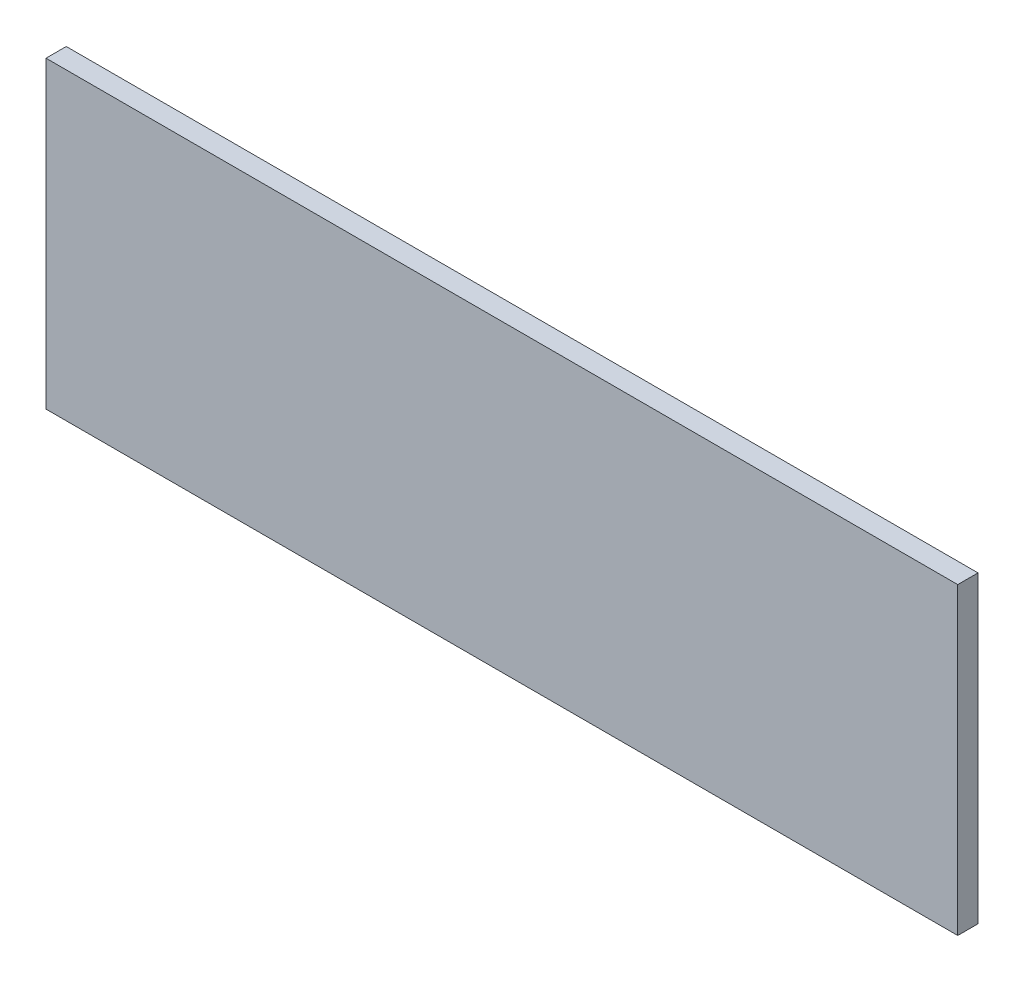
ISO-10303-21;
HEADER;
FILE_DESCRIPTION(('STEP AP214'),'2;1');
FILE_NAME('part.step','',(''),(''),'','','');
FILE_SCHEMA(('AUTOMOTIVE_DESIGN { 1 0 10303 214 1 1 1 1 }'));
ENDSEC;
DATA;
#1=APPLICATION_CONTEXT('core data for automotive mechanical design processes');
#2=APPLICATION_PROTOCOL_DEFINITION('international standard','automotive_design',2000,#1);
#3=PRODUCT_CONTEXT('',#1,'mechanical');
#4=PRODUCT('Part','Part','',(#3));
#5=PRODUCT_RELATED_PRODUCT_CATEGORY('part','',(#4));
#6=PRODUCT_DEFINITION_FORMATION('','',#4);
#7=PRODUCT_DEFINITION_CONTEXT('part definition',#1,'design');
#8=PRODUCT_DEFINITION('design','',#6,#7);
#9=PRODUCT_DEFINITION_SHAPE('','',#8);
#10=(LENGTH_UNIT() NAMED_UNIT(*) SI_UNIT(.MILLI.,.METRE.));
#11=(NAMED_UNIT(*) PLANE_ANGLE_UNIT() SI_UNIT($,.RADIAN.));
#12=(NAMED_UNIT(*) SI_UNIT($,.STERADIAN.) SOLID_ANGLE_UNIT());
#13=UNCERTAINTY_MEASURE_WITH_UNIT(LENGTH_MEASURE(1.E-05),#10,'distance_accuracy_value','');
#14=(GEOMETRIC_REPRESENTATION_CONTEXT(3) GLOBAL_UNCERTAINTY_ASSIGNED_CONTEXT((#13)) GLOBAL_UNIT_ASSIGNED_CONTEXT((#10,
#11,#12)) REPRESENTATION_CONTEXT('',''));
#15=CARTESIAN_POINT('',(0.,0.,0.));
#16=DIRECTION('',(0.,0.,1.));
#17=DIRECTION('',(1.,0.,0.));
#18=AXIS2_PLACEMENT_3D('',#15,#16,#17);
#19=CARTESIAN_POINT('',(45.0000000000001,30.,-1.));
#20=DIRECTION('',(-1.,0.,0.));
#21=DIRECTION('',(0.,0.,1.));
#22=AXIS2_PLACEMENT_3D('',#19,#20,#21);
#23=PLANE('',#22);
#24=DIRECTION('',(0.,0.,-1.));
#25=VECTOR('',#24,1.);
#26=CARTESIAN_POINT('',(45.0000000000001,0.,-1.));
#27=LINE('',#26,#25);
#28=CARTESIAN_POINT('',(45.0000000000001,0.,1.));
#29=VERTEX_POINT('',#28);
#30=CARTESIAN_POINT('',(45.0000000000001,0.,-1.));
#31=VERTEX_POINT('',#30);
#32=EDGE_CURVE('E98',#29,#31,#27,.T.);
#33=ORIENTED_EDGE('',*,*,#32,.T.);
#34=DIRECTION('',(0.,-1.,0.));
#35=VECTOR('',#34,1.);
#36=CARTESIAN_POINT('',(45.0000000000001,30.,-1.));
#37=LINE('',#36,#35);
#38=CARTESIAN_POINT('',(45.0000000000001,30.,-1.));
#39=VERTEX_POINT('',#38);
#40=EDGE_CURVE('E11',#39,#31,#37,.T.);
#41=ORIENTED_EDGE('',*,*,#40,.F.);
#42=DIRECTION('',(0.,0.,-1.));
#43=VECTOR('',#42,1.);
#44=CARTESIAN_POINT('',(45.0000000000001,30.,-1.));
#45=LINE('',#44,#43);
#46=CARTESIAN_POINT('',(45.0000000000001,30.,1.));
#47=VERTEX_POINT('',#46);
#48=EDGE_CURVE('E86',#47,#39,#45,.T.);
#49=ORIENTED_EDGE('',*,*,#48,.F.);
#50=DIRECTION('',(0.,-1.,0.));
#51=VECTOR('',#50,1.);
#52=CARTESIAN_POINT('',(45.0000000000001,30.,1.));
#53=LINE('',#52,#51);
#54=EDGE_CURVE('E94',#47,#29,#53,.T.);
#55=ORIENTED_EDGE('',*,*,#54,.T.);
#56=EDGE_LOOP('',(#33,#41,#49,#55));
#57=FACE_BOUND('',#56,.T.);
#58=ADVANCED_FACE('F35',(#57),#23,.F.);
#59=CARTESIAN_POINT('',(-45.,30.,-1.));
#60=DIRECTION('',(0.,0.,1.));
#61=DIRECTION('',(1.,0.,0.));
#62=AXIS2_PLACEMENT_3D('',#59,#60,#61);
#63=PLANE('',#62);
#64=DIRECTION('',(-1.,0.,0.));
#65=VECTOR('',#64,1.);
#66=CARTESIAN_POINT('',(-45.,0.,-1.));
#67=LINE('',#66,#65);
#68=CARTESIAN_POINT('',(-45.,0.,-1.));
#69=VERTEX_POINT('',#68);
#70=EDGE_CURVE('E90',#31,#69,#67,.T.);
#71=ORIENTED_EDGE('',*,*,#70,.T.);
#72=DIRECTION('',(0.,-1.,0.));
#73=VECTOR('',#72,1.);
#74=CARTESIAN_POINT('',(-45.,30.,-1.));
#75=LINE('',#74,#73);
#76=CARTESIAN_POINT('',(-45.,30.,-1.));
#77=VERTEX_POINT('',#76);
#78=EDGE_CURVE('E43',#77,#69,#75,.T.);
#79=ORIENTED_EDGE('',*,*,#78,.F.);
#80=DIRECTION('',(-1.,0.,0.));
#81=VECTOR('',#80,1.);
#82=CARTESIAN_POINT('',(-45.,30.,-1.));
#83=LINE('',#82,#81);
#84=EDGE_CURVE('E81',#39,#77,#83,.T.);
#85=ORIENTED_EDGE('',*,*,#84,.F.);
#86=ORIENTED_EDGE('',*,*,#40,.T.);
#87=EDGE_LOOP('',(#71,#79,#85,#86));
#88=FACE_BOUND('',#87,.T.);
#89=ADVANCED_FACE('F89',(#88),#63,.F.);
#90=CARTESIAN_POINT('',(-45.,30.,-1.));
#91=DIRECTION('',(1.,0.,0.));
#92=DIRECTION('',(0.,0.,-1.));
#93=AXIS2_PLACEMENT_3D('',#90,#91,#92);
#94=PLANE('',#93);
#95=DIRECTION('',(0.,0.,1.));
#96=VECTOR('',#95,1.);
#97=CARTESIAN_POINT('',(-45.,0.,-1.));
#98=LINE('',#97,#96);
#99=CARTESIAN_POINT('',(-45.,0.,1.));
#100=VERTEX_POINT('',#99);
#101=EDGE_CURVE('E68',#69,#100,#98,.T.);
#102=ORIENTED_EDGE('',*,*,#101,.T.);
#103=DIRECTION('',(0.,-1.,0.));
#104=VECTOR('',#103,1.);
#105=CARTESIAN_POINT('',(-45.,30.,1.));
#106=LINE('',#105,#104);
#107=CARTESIAN_POINT('',(-45.,30.,1.));
#108=VERTEX_POINT('',#107);
#109=EDGE_CURVE('E91',#108,#100,#106,.T.);
#110=ORIENTED_EDGE('',*,*,#109,.F.);
#111=DIRECTION('',(0.,0.,1.));
#112=VECTOR('',#111,1.);
#113=CARTESIAN_POINT('',(-45.,30.,-1.));
#114=LINE('',#113,#112);
#115=EDGE_CURVE('E84',#77,#108,#114,.T.);
#116=ORIENTED_EDGE('',*,*,#115,.F.);
#117=ORIENTED_EDGE('',*,*,#78,.T.);
#118=EDGE_LOOP('',(#102,#110,#116,#117));
#119=FACE_BOUND('',#118,.T.);
#120=ADVANCED_FACE('F92',(#119),#94,.F.);
#121=CARTESIAN_POINT('',(-45.,30.,1.));
#122=DIRECTION('',(0.,0.,-1.));
#123=DIRECTION('',(-1.,0.,0.));
#124=AXIS2_PLACEMENT_3D('',#121,#122,#123);
#125=PLANE('',#124);
#126=DIRECTION('',(1.,0.,0.));
#127=VECTOR('',#126,1.);
#128=CARTESIAN_POINT('',(-45.,0.,1.));
#129=LINE('',#128,#127);
#130=EDGE_CURVE('E74',#100,#29,#129,.T.);
#131=ORIENTED_EDGE('',*,*,#130,.T.);
#132=ORIENTED_EDGE('',*,*,#54,.F.);
#133=DIRECTION('',(1.,0.,0.));
#134=VECTOR('',#133,1.);
#135=CARTESIAN_POINT('',(-45.,30.,1.));
#136=LINE('',#135,#134);
#137=EDGE_CURVE('E51',#108,#47,#136,.T.);
#138=ORIENTED_EDGE('',*,*,#137,.F.);
#139=ORIENTED_EDGE('',*,*,#109,.T.);
#140=EDGE_LOOP('',(#131,#132,#138,#139));
#141=FACE_BOUND('',#140,.T.);
#142=ADVANCED_FACE('F105',(#141),#125,.F.);
#143=CARTESIAN_POINT('',(0.,30.,0.));
#144=DIRECTION('',(0.,1.,0.));
#145=DIRECTION('',(0.,0.,1.));
#146=AXIS2_PLACEMENT_3D('',#143,#144,#145);
#147=PLANE('',#146);
#148=ORIENTED_EDGE('',*,*,#48,.T.);
#149=ORIENTED_EDGE('',*,*,#84,.T.);
#150=ORIENTED_EDGE('',*,*,#115,.T.);
#151=ORIENTED_EDGE('',*,*,#137,.T.);
#152=EDGE_LOOP('',(#148,#149,#150,#151));
#153=FACE_BOUND('',#152,.T.);
#154=ADVANCED_FACE('F82',(#153),#147,.T.);
#155=CARTESIAN_POINT('',(0.,0.,0.));
#156=DIRECTION('',(0.,1.,0.));
#157=DIRECTION('',(0.,0.,1.));
#158=AXIS2_PLACEMENT_3D('',#155,#156,#157);
#159=PLANE('',#158);
#160=ORIENTED_EDGE('',*,*,#32,.F.);
#161=ORIENTED_EDGE('',*,*,#130,.F.);
#162=ORIENTED_EDGE('',*,*,#101,.F.);
#163=ORIENTED_EDGE('',*,*,#70,.F.);
#164=EDGE_LOOP('',(#160,#161,#162,#163));
#165=FACE_BOUND('',#164,.T.);
#166=ADVANCED_FACE('F108',(#165),#159,.F.);
#167=CLOSED_SHELL('',(#58,#89,#120,#142,#154,#166));
#168=MANIFOLD_SOLID_BREP('B2',#167);
#169=ADVANCED_BREP_SHAPE_REPRESENTATION('',(#18,#168),#14);
#170=SHAPE_DEFINITION_REPRESENTATION(#9,#169);
ENDSEC;
END-ISO-10303-21;
